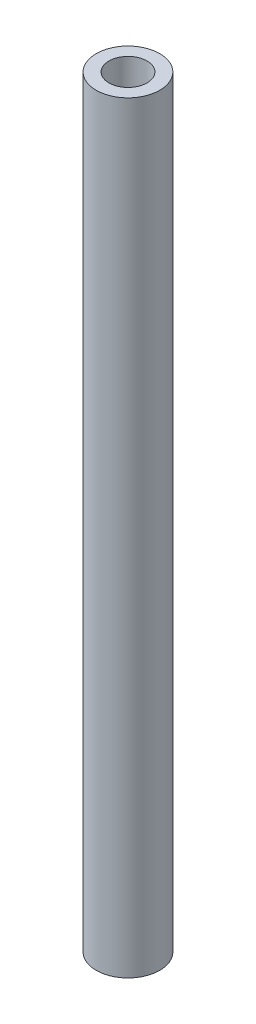
ISO-10303-21;
HEADER;
FILE_DESCRIPTION(('STEP AP214'),'2;1');
FILE_NAME('part.step','',(''),(''),'','','');
FILE_SCHEMA(('AUTOMOTIVE_DESIGN { 1 0 10303 214 1 1 1 1 }'));
ENDSEC;
DATA;
#1=APPLICATION_CONTEXT('core data for automotive mechanical design processes');
#2=APPLICATION_PROTOCOL_DEFINITION('international standard','automotive_design',2000,#1);
#3=PRODUCT_CONTEXT('',#1,'mechanical');
#4=PRODUCT('Part','Part','',(#3));
#5=PRODUCT_RELATED_PRODUCT_CATEGORY('part','',(#4));
#6=PRODUCT_DEFINITION_FORMATION('','',#4);
#7=PRODUCT_DEFINITION_CONTEXT('part definition',#1,'design');
#8=PRODUCT_DEFINITION('design','',#6,#7);
#9=PRODUCT_DEFINITION_SHAPE('','',#8);
#10=(LENGTH_UNIT() NAMED_UNIT(*) SI_UNIT(.MILLI.,.METRE.));
#11=(NAMED_UNIT(*) PLANE_ANGLE_UNIT() SI_UNIT($,.RADIAN.));
#12=(NAMED_UNIT(*) SI_UNIT($,.STERADIAN.) SOLID_ANGLE_UNIT());
#13=UNCERTAINTY_MEASURE_WITH_UNIT(LENGTH_MEASURE(1.E-05),#10,'distance_accuracy_value','');
#14=(GEOMETRIC_REPRESENTATION_CONTEXT(3) GLOBAL_UNCERTAINTY_ASSIGNED_CONTEXT((#13)) GLOBAL_UNIT_ASSIGNED_CONTEXT((#10,
#11,#12)) REPRESENTATION_CONTEXT('',''));
#15=CARTESIAN_POINT('',(0.,0.,0.));
#16=DIRECTION('',(0.,0.,1.));
#17=DIRECTION('',(1.,0.,0.));
#18=AXIS2_PLACEMENT_3D('',#15,#16,#17);
#19=CARTESIAN_POINT('',(0.,60.,0.));
#20=DIRECTION('',(0.,1.,0.));
#21=DIRECTION('',(0.,0.,1.));
#22=AXIS2_PLACEMENT_3D('',#19,#20,#21);
#23=PLANE('',#22);
#24=CARTESIAN_POINT('',(0.,60.,0.));
#25=DIRECTION('',(0.,1.,0.));
#26=DIRECTION('',(0.,0.,1.));
#27=AXIS2_PLACEMENT_3D('',#24,#25,#26);
#28=CIRCLE('',#27,2.5);
#29=CARTESIAN_POINT('',(0.,60.,2.5));
#30=VERTEX_POINT('',#29);
#31=EDGE_CURVE('E10',#30,#30,#28,.T.);
#32=ORIENTED_EDGE('',*,*,#31,.T.);
#33=EDGE_LOOP('',(#32));
#34=FACE_BOUND('',#33,.T.);
#35=CARTESIAN_POINT('',(0.,60.,0.));
#36=DIRECTION('',(0.,1.,0.));
#37=DIRECTION('',(0.,0.,1.));
#38=AXIS2_PLACEMENT_3D('',#35,#36,#37);
#39=CIRCLE('',#38,1.5);
#40=CARTESIAN_POINT('',(0.,60.,1.5));
#41=VERTEX_POINT('',#40);
#42=EDGE_CURVE('E54',#41,#41,#39,.T.);
#43=ORIENTED_EDGE('',*,*,#42,.F.);
#44=EDGE_LOOP('',(#43));
#45=FACE_BOUND('',#44,.T.);
#46=ADVANCED_FACE('F41',(#34,#45),#23,.T.);
#47=CARTESIAN_POINT('',(0.,0.,0.));
#48=DIRECTION('',(0.,1.,0.));
#49=DIRECTION('',(0.,0.,1.));
#50=AXIS2_PLACEMENT_3D('',#47,#48,#49);
#51=PLANE('',#50);
#52=CARTESIAN_POINT('',(0.,0.,0.));
#53=DIRECTION('',(0.,1.,0.));
#54=DIRECTION('',(0.,0.,1.));
#55=AXIS2_PLACEMENT_3D('',#52,#53,#54);
#56=CIRCLE('',#55,2.5);
#57=CARTESIAN_POINT('',(0.,0.,2.5));
#58=VERTEX_POINT('',#57);
#59=EDGE_CURVE('E45',#58,#58,#56,.T.);
#60=ORIENTED_EDGE('',*,*,#59,.F.);
#61=EDGE_LOOP('',(#60));
#62=FACE_BOUND('',#61,.T.);
#63=CARTESIAN_POINT('',(0.,0.,0.));
#64=DIRECTION('',(0.,1.,0.));
#65=DIRECTION('',(0.,0.,1.));
#66=AXIS2_PLACEMENT_3D('',#63,#64,#65);
#67=CIRCLE('',#66,1.5);
#68=CARTESIAN_POINT('',(0.,0.,1.5));
#69=VERTEX_POINT('',#68);
#70=EDGE_CURVE('E56',#69,#69,#67,.T.);
#71=ORIENTED_EDGE('',*,*,#70,.T.);
#72=EDGE_LOOP('',(#71));
#73=FACE_BOUND('',#72,.T.);
#74=ADVANCED_FACE('F68',(#62,#73),#51,.F.);
#75=CARTESIAN_POINT('',(0.,60.,0.));
#76=DIRECTION('',(0.,-1.,0.));
#77=DIRECTION('',(0.,0.,-1.));
#78=AXIS2_PLACEMENT_3D('',#75,#76,#77);
#79=CYLINDRICAL_SURFACE('',#78,2.5);
#80=ORIENTED_EDGE('',*,*,#31,.F.);
#81=EDGE_LOOP('',(#80));
#82=FACE_BOUND('',#81,.T.);
#83=ORIENTED_EDGE('',*,*,#59,.T.);
#84=EDGE_LOOP('',(#83));
#85=FACE_BOUND('',#84,.T.);
#86=ADVANCED_FACE('F43',(#82,#85),#79,.T.);
#87=CARTESIAN_POINT('',(0.,60.,0.));
#88=DIRECTION('',(0.,-1.,0.));
#89=DIRECTION('',(0.,0.,-1.));
#90=AXIS2_PLACEMENT_3D('',#87,#88,#89);
#91=CYLINDRICAL_SURFACE('',#90,1.5);
#92=ORIENTED_EDGE('',*,*,#42,.T.);
#93=EDGE_LOOP('',(#92));
#94=FACE_BOUND('',#93,.T.);
#95=ORIENTED_EDGE('',*,*,#70,.F.);
#96=EDGE_LOOP('',(#95));
#97=FACE_BOUND('',#96,.T.);
#98=ADVANCED_FACE('F64',(#94,#97),#91,.F.);
#99=CLOSED_SHELL('',(#46,#74,#86,#98));
#100=MANIFOLD_SOLID_BREP('B2',#99);
#101=ADVANCED_BREP_SHAPE_REPRESENTATION('',(#18,#100),#14);
#102=SHAPE_DEFINITION_REPRESENTATION(#9,#101);
ENDSEC;
END-ISO-10303-21;
